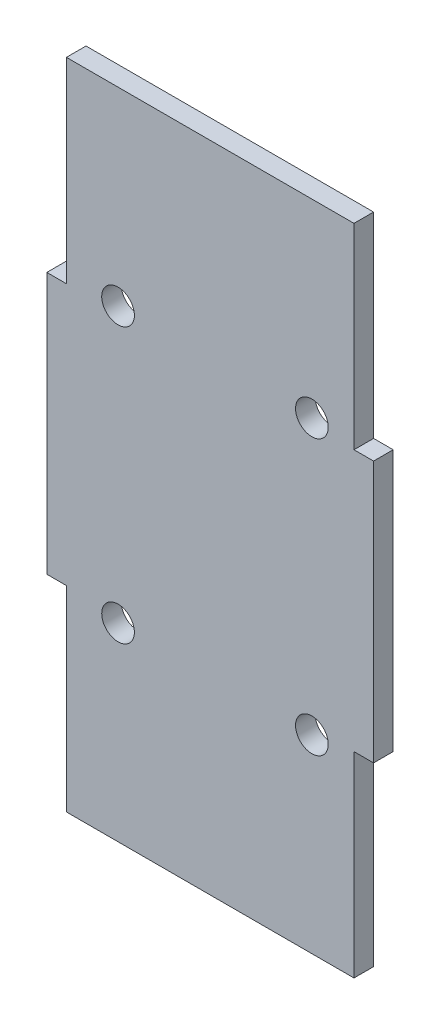
ISO-10303-21;
HEADER;
FILE_DESCRIPTION(('STEP AP214'),'2;1');
FILE_NAME('part.step','',(''),(''),'','','');
FILE_SCHEMA(('AUTOMOTIVE_DESIGN { 1 0 10303 214 1 1 1 1 }'));
ENDSEC;
DATA;
#1=APPLICATION_CONTEXT('core data for automotive mechanical design processes');
#2=APPLICATION_PROTOCOL_DEFINITION('international standard','automotive_design',2000,#1);
#3=PRODUCT_CONTEXT('',#1,'mechanical');
#4=PRODUCT('Part','Part','',(#3));
#5=PRODUCT_RELATED_PRODUCT_CATEGORY('part','',(#4));
#6=PRODUCT_DEFINITION_FORMATION('','',#4);
#7=PRODUCT_DEFINITION_CONTEXT('part definition',#1,'design');
#8=PRODUCT_DEFINITION('design','',#6,#7);
#9=PRODUCT_DEFINITION_SHAPE('','',#8);
#10=(LENGTH_UNIT() NAMED_UNIT(*) SI_UNIT(.MILLI.,.METRE.));
#11=(NAMED_UNIT(*) PLANE_ANGLE_UNIT() SI_UNIT($,.RADIAN.));
#12=(NAMED_UNIT(*) SI_UNIT($,.STERADIAN.) SOLID_ANGLE_UNIT());
#13=UNCERTAINTY_MEASURE_WITH_UNIT(LENGTH_MEASURE(1.E-05),#10,'distance_accuracy_value','');
#14=(GEOMETRIC_REPRESENTATION_CONTEXT(3) GLOBAL_UNCERTAINTY_ASSIGNED_CONTEXT((#13)) GLOBAL_UNIT_ASSIGNED_CONTEXT((#10,
#11,#12)) REPRESENTATION_CONTEXT('',''));
#15=CARTESIAN_POINT('',(0.,0.,0.));
#16=DIRECTION('',(0.,0.,1.));
#17=DIRECTION('',(1.,0.,0.));
#18=AXIS2_PLACEMENT_3D('',#15,#16,#17);
#19=CARTESIAN_POINT('',(0.,0.,3.));
#20=DIRECTION('',(0.,0.,-1.));
#21=DIRECTION('',(-1.,0.,0.));
#22=AXIS2_PLACEMENT_3D('',#19,#20,#21);
#23=PLANE('',#22);
#24=DIRECTION('',(0.,-1.,0.));
#25=VECTOR('',#24,1.);
#26=CARTESIAN_POINT('',(-25.,-30.7246376811594,3.));
#27=LINE('',#26,#25);
#28=CARTESIAN_POINT('',(-25.,9.27536231884058,3.));
#29=VERTEX_POINT('',#28);
#30=CARTESIAN_POINT('',(-25.,-30.7246376811594,3.));
#31=VERTEX_POINT('',#30);
#32=EDGE_CURVE('E200',#29,#31,#27,.T.);
#33=ORIENTED_EDGE('',*,*,#32,.T.);
#34=DIRECTION('',(1.,0.,0.));
#35=VECTOR('',#34,1.);
#36=CARTESIAN_POINT('',(-22.,-30.7246376811594,3.));
#37=LINE('',#36,#35);
#38=CARTESIAN_POINT('',(-22.,-30.7246376811594,3.));
#39=VERTEX_POINT('',#38);
#40=EDGE_CURVE('E112',#31,#39,#37,.T.);
#41=ORIENTED_EDGE('',*,*,#40,.T.);
#42=DIRECTION('',(0.,-1.,0.));
#43=VECTOR('',#42,1.);
#44=CARTESIAN_POINT('',(-22.,-30.7246376811594,3.));
#45=LINE('',#44,#43);
#46=CARTESIAN_POINT('',(-22.,-60.7246376811594,3.));
#47=VERTEX_POINT('',#46);
#48=EDGE_CURVE('E237',#39,#47,#45,.T.);
#49=ORIENTED_EDGE('',*,*,#48,.T.);
#50=DIRECTION('',(1.,0.,0.));
#51=VECTOR('',#50,1.);
#52=CARTESIAN_POINT('',(22.,-60.7246376811594,3.));
#53=LINE('',#52,#51);
#54=CARTESIAN_POINT('',(22.,-60.7246376811594,3.));
#55=VERTEX_POINT('',#54);
#56=EDGE_CURVE('E257',#47,#55,#53,.T.);
#57=ORIENTED_EDGE('',*,*,#56,.T.);
#58=DIRECTION('',(0.,1.,0.));
#59=VECTOR('',#58,1.);
#60=CARTESIAN_POINT('',(22.,-30.7246376811594,3.));
#61=LINE('',#60,#59);
#62=CARTESIAN_POINT('',(22.,-30.7246376811594,3.));
#63=VERTEX_POINT('',#62);
#64=EDGE_CURVE('E253',#55,#63,#61,.T.);
#65=ORIENTED_EDGE('',*,*,#64,.T.);
#66=DIRECTION('',(1.,0.,0.));
#67=VECTOR('',#66,1.);
#68=CARTESIAN_POINT('',(22.,-30.7246376811594,3.));
#69=LINE('',#68,#67);
#70=CARTESIAN_POINT('',(25.,-30.7246376811594,3.));
#71=VERTEX_POINT('',#70);
#72=EDGE_CURVE('E256',#63,#71,#69,.T.);
#73=ORIENTED_EDGE('',*,*,#72,.T.);
#74=DIRECTION('',(0.,1.,0.));
#75=VECTOR('',#74,1.);
#76=CARTESIAN_POINT('',(25.,-30.7246376811594,3.));
#77=LINE('',#76,#75);
#78=CARTESIAN_POINT('',(25.,9.27536231884058,3.));
#79=VERTEX_POINT('',#78);
#80=EDGE_CURVE('E261',#71,#79,#77,.T.);
#81=ORIENTED_EDGE('',*,*,#80,.T.);
#82=DIRECTION('',(-1.,0.,0.));
#83=VECTOR('',#82,1.);
#84=CARTESIAN_POINT('',(25.,9.27536231884058,3.));
#85=LINE('',#84,#83);
#86=CARTESIAN_POINT('',(22.,9.27536231884058,3.));
#87=VERTEX_POINT('',#86);
#88=EDGE_CURVE('E268',#79,#87,#85,.T.);
#89=ORIENTED_EDGE('',*,*,#88,.T.);
#90=DIRECTION('',(0.,1.,0.));
#91=VECTOR('',#90,1.);
#92=CARTESIAN_POINT('',(22.,9.27536231884058,3.));
#93=LINE('',#92,#91);
#94=CARTESIAN_POINT('',(22.,39.2753623188406,3.));
#95=VERTEX_POINT('',#94);
#96=EDGE_CURVE('E143',#87,#95,#93,.T.);
#97=ORIENTED_EDGE('',*,*,#96,.T.);
#98=DIRECTION('',(-1.,0.,0.));
#99=VECTOR('',#98,1.);
#100=CARTESIAN_POINT('',(22.,39.2753623188406,3.));
#101=LINE('',#100,#99);
#102=CARTESIAN_POINT('',(-22.,39.2753623188406,3.));
#103=VERTEX_POINT('',#102);
#104=EDGE_CURVE('E137',#95,#103,#101,.T.);
#105=ORIENTED_EDGE('',*,*,#104,.T.);
#106=DIRECTION('',(0.,-1.,0.));
#107=VECTOR('',#106,1.);
#108=CARTESIAN_POINT('',(-22.,9.27536231884058,3.));
#109=LINE('',#108,#107);
#110=CARTESIAN_POINT('',(-22.,9.27536231884058,3.));
#111=VERTEX_POINT('',#110);
#112=EDGE_CURVE('E141',#103,#111,#109,.T.);
#113=ORIENTED_EDGE('',*,*,#112,.T.);
#114=DIRECTION('',(-1.,0.,0.));
#115=VECTOR('',#114,1.);
#116=CARTESIAN_POINT('',(-25.,9.27536231884058,3.));
#117=LINE('',#116,#115);
#118=EDGE_CURVE('E57',#111,#29,#117,.T.);
#119=ORIENTED_EDGE('',*,*,#118,.T.);
#120=EDGE_LOOP('',(#33,#41,#49,#57,#65,#73,#81,#89,#97,#105,#113,#119));
#121=FACE_BOUND('',#120,.T.);
#122=CARTESIAN_POINT('',(15.5589565336524,10.2753623188406,3.));
#123=DIRECTION('',(0.,0.,1.));
#124=DIRECTION('',(1.,0.,0.));
#125=AXIS2_PLACEMENT_3D('',#122,#123,#124);
#126=CIRCLE('',#125,2.5);
#127=CARTESIAN_POINT('',(18.0589565336524,10.2753623188406,3.));
#128=VERTEX_POINT('',#127);
#129=EDGE_CURVE('E170',#128,#128,#126,.T.);
#130=ORIENTED_EDGE('',*,*,#129,.F.);
#131=EDGE_LOOP('',(#130));
#132=FACE_BOUND('',#131,.T.);
#133=CARTESIAN_POINT('',(-14.0986136380151,10.2753623188406,3.));
#134=DIRECTION('',(0.,0.,1.));
#135=DIRECTION('',(1.,0.,0.));
#136=AXIS2_PLACEMENT_3D('',#133,#134,#135);
#137=CIRCLE('',#136,2.5);
#138=CARTESIAN_POINT('',(-11.5986136380151,10.2753623188406,3.));
#139=VERTEX_POINT('',#138);
#140=EDGE_CURVE('E338',#139,#139,#137,.T.);
#141=ORIENTED_EDGE('',*,*,#140,.F.);
#142=EDGE_LOOP('',(#141));
#143=FACE_BOUND('',#142,.T.);
#144=CARTESIAN_POINT('',(15.5589565336524,-31.7246376811594,3.));
#145=DIRECTION('',(0.,0.,1.));
#146=DIRECTION('',(-1.,0.,0.));
#147=AXIS2_PLACEMENT_3D('',#144,#145,#146);
#148=CIRCLE('',#147,2.5);
#149=CARTESIAN_POINT('',(13.0589565336524,-31.7246376811594,3.));
#150=VERTEX_POINT('',#149);
#151=EDGE_CURVE('E330',#150,#150,#148,.T.);
#152=ORIENTED_EDGE('',*,*,#151,.F.);
#153=EDGE_LOOP('',(#152));
#154=FACE_BOUND('',#153,.T.);
#155=CARTESIAN_POINT('',(-14.0986136380151,-31.7246376811594,3.));
#156=DIRECTION('',(0.,0.,1.));
#157=DIRECTION('',(-1.,0.,0.));
#158=AXIS2_PLACEMENT_3D('',#155,#156,#157);
#159=CIRCLE('',#158,2.5);
#160=CARTESIAN_POINT('',(-16.5986136380151,-31.7246376811594,3.));
#161=VERTEX_POINT('',#160);
#162=EDGE_CURVE('E319',#161,#161,#159,.T.);
#163=ORIENTED_EDGE('',*,*,#162,.F.);
#164=EDGE_LOOP('',(#163));
#165=FACE_BOUND('',#164,.T.);
#166=ADVANCED_FACE('F39',(#121,#132,#143,#154,#165),#23,.F.);
#167=CARTESIAN_POINT('',(0.,0.,0.));
#168=DIRECTION('',(0.,0.,-1.));
#169=DIRECTION('',(-1.,0.,0.));
#170=AXIS2_PLACEMENT_3D('',#167,#168,#169);
#171=PLANE('',#170);
#172=CARTESIAN_POINT('',(15.5589565336524,-31.7246376811594,0.));
#173=DIRECTION('',(0.,0.,1.));
#174=DIRECTION('',(-1.,0.,0.));
#175=AXIS2_PLACEMENT_3D('',#172,#173,#174);
#176=CIRCLE('',#175,2.5);
#177=CARTESIAN_POINT('',(13.0589565336524,-31.7246376811594,0.));
#178=VERTEX_POINT('',#177);
#179=EDGE_CURVE('E327',#178,#178,#176,.T.);
#180=ORIENTED_EDGE('',*,*,#179,.T.);
#181=EDGE_LOOP('',(#180));
#182=FACE_BOUND('',#181,.T.);
#183=CARTESIAN_POINT('',(15.5589565336524,10.2753623188406,0.));
#184=DIRECTION('',(0.,0.,1.));
#185=DIRECTION('',(1.,0.,0.));
#186=AXIS2_PLACEMENT_3D('',#183,#184,#185);
#187=CIRCLE('',#186,2.5);
#188=CARTESIAN_POINT('',(18.0589565336524,10.2753623188406,0.));
#189=VERTEX_POINT('',#188);
#190=EDGE_CURVE('E342',#189,#189,#187,.T.);
#191=ORIENTED_EDGE('',*,*,#190,.T.);
#192=EDGE_LOOP('',(#191));
#193=FACE_BOUND('',#192,.T.);
#194=DIRECTION('',(0.,-1.,0.));
#195=VECTOR('',#194,1.);
#196=CARTESIAN_POINT('',(-25.,-30.7246376811594,0.));
#197=LINE('',#196,#195);
#198=CARTESIAN_POINT('',(-25.,9.27536231884058,0.));
#199=VERTEX_POINT('',#198);
#200=CARTESIAN_POINT('',(-25.,-30.7246376811594,0.));
#201=VERTEX_POINT('',#200);
#202=EDGE_CURVE('E165',#199,#201,#197,.T.);
#203=ORIENTED_EDGE('',*,*,#202,.F.);
#204=DIRECTION('',(-1.,0.,0.));
#205=VECTOR('',#204,1.);
#206=CARTESIAN_POINT('',(-25.,9.27536231884058,0.));
#207=LINE('',#206,#205);
#208=CARTESIAN_POINT('',(-22.,9.27536231884058,0.));
#209=VERTEX_POINT('',#208);
#210=EDGE_CURVE('E104',#209,#199,#207,.T.);
#211=ORIENTED_EDGE('',*,*,#210,.F.);
#212=DIRECTION('',(0.,-1.,0.));
#213=VECTOR('',#212,1.);
#214=CARTESIAN_POINT('',(-22.,9.27536231884058,0.));
#215=LINE('',#214,#213);
#216=CARTESIAN_POINT('',(-22.,39.2753623188406,0.));
#217=VERTEX_POINT('',#216);
#218=EDGE_CURVE('E98',#217,#209,#215,.T.);
#219=ORIENTED_EDGE('',*,*,#218,.F.);
#220=DIRECTION('',(-1.,0.,0.));
#221=VECTOR('',#220,1.);
#222=CARTESIAN_POINT('',(22.,39.2753623188406,0.));
#223=LINE('',#222,#221);
#224=CARTESIAN_POINT('',(22.,39.2753623188406,0.));
#225=VERTEX_POINT('',#224);
#226=EDGE_CURVE('E152',#225,#217,#223,.T.);
#227=ORIENTED_EDGE('',*,*,#226,.F.);
#228=DIRECTION('',(0.,1.,0.));
#229=VECTOR('',#228,1.);
#230=CARTESIAN_POINT('',(22.,9.27536231884058,0.));
#231=LINE('',#230,#229);
#232=CARTESIAN_POINT('',(22.,9.27536231884058,0.));
#233=VERTEX_POINT('',#232);
#234=EDGE_CURVE('E191',#233,#225,#231,.T.);
#235=ORIENTED_EDGE('',*,*,#234,.F.);
#236=DIRECTION('',(-1.,0.,0.));
#237=VECTOR('',#236,1.);
#238=CARTESIAN_POINT('',(25.,9.27536231884058,0.));
#239=LINE('',#238,#237);
#240=CARTESIAN_POINT('',(25.,9.27536231884058,0.));
#241=VERTEX_POINT('',#240);
#242=EDGE_CURVE('E188',#241,#233,#239,.T.);
#243=ORIENTED_EDGE('',*,*,#242,.F.);
#244=DIRECTION('',(0.,1.,0.));
#245=VECTOR('',#244,1.);
#246=CARTESIAN_POINT('',(25.,-30.7246376811594,0.));
#247=LINE('',#246,#245);
#248=CARTESIAN_POINT('',(25.,-30.7246376811594,0.));
#249=VERTEX_POINT('',#248);
#250=EDGE_CURVE('E185',#249,#241,#247,.T.);
#251=ORIENTED_EDGE('',*,*,#250,.F.);
#252=DIRECTION('',(1.,0.,0.));
#253=VECTOR('',#252,1.);
#254=CARTESIAN_POINT('',(22.,-30.7246376811594,0.));
#255=LINE('',#254,#253);
#256=CARTESIAN_POINT('',(22.,-30.7246376811594,0.));
#257=VERTEX_POINT('',#256);
#258=EDGE_CURVE('E182',#257,#249,#255,.T.);
#259=ORIENTED_EDGE('',*,*,#258,.F.);
#260=DIRECTION('',(0.,1.,0.));
#261=VECTOR('',#260,1.);
#262=CARTESIAN_POINT('',(22.,-30.7246376811594,0.));
#263=LINE('',#262,#261);
#264=CARTESIAN_POINT('',(22.,-60.7246376811594,0.));
#265=VERTEX_POINT('',#264);
#266=EDGE_CURVE('E179',#265,#257,#263,.T.);
#267=ORIENTED_EDGE('',*,*,#266,.F.);
#268=DIRECTION('',(1.,0.,0.));
#269=VECTOR('',#268,1.);
#270=CARTESIAN_POINT('',(22.,-60.7246376811594,0.));
#271=LINE('',#270,#269);
#272=CARTESIAN_POINT('',(-22.,-60.7246376811594,0.));
#273=VERTEX_POINT('',#272);
#274=EDGE_CURVE('E176',#273,#265,#271,.T.);
#275=ORIENTED_EDGE('',*,*,#274,.F.);
#276=DIRECTION('',(0.,-1.,0.));
#277=VECTOR('',#276,1.);
#278=CARTESIAN_POINT('',(-22.,-30.7246376811594,0.));
#279=LINE('',#278,#277);
#280=CARTESIAN_POINT('',(-22.,-30.7246376811594,0.));
#281=VERTEX_POINT('',#280);
#282=EDGE_CURVE('E173',#281,#273,#279,.T.);
#283=ORIENTED_EDGE('',*,*,#282,.F.);
#284=DIRECTION('',(1.,0.,0.));
#285=VECTOR('',#284,1.);
#286=CARTESIAN_POINT('',(-22.,-30.7246376811594,0.));
#287=LINE('',#286,#285);
#288=EDGE_CURVE('E169',#201,#281,#287,.T.);
#289=ORIENTED_EDGE('',*,*,#288,.F.);
#290=EDGE_LOOP('',(#203,#211,#219,#227,#235,#243,#251,#259,#267,#275,#283,#289));
#291=FACE_BOUND('',#290,.T.);
#292=CARTESIAN_POINT('',(-14.0986136380151,10.2753623188406,0.));
#293=DIRECTION('',(0.,0.,1.));
#294=DIRECTION('',(1.,0.,0.));
#295=AXIS2_PLACEMENT_3D('',#292,#293,#294);
#296=CIRCLE('',#295,2.5);
#297=CARTESIAN_POINT('',(-11.5986136380151,10.2753623188406,0.));
#298=VERTEX_POINT('',#297);
#299=EDGE_CURVE('E334',#298,#298,#296,.T.);
#300=ORIENTED_EDGE('',*,*,#299,.T.);
#301=EDGE_LOOP('',(#300));
#302=FACE_BOUND('',#301,.T.);
#303=CARTESIAN_POINT('',(-14.0986136380151,-31.7246376811594,0.));
#304=DIRECTION('',(0.,0.,1.));
#305=DIRECTION('',(-1.,0.,0.));
#306=AXIS2_PLACEMENT_3D('',#303,#304,#305);
#307=CIRCLE('',#306,2.5);
#308=CARTESIAN_POINT('',(-16.5986136380151,-31.7246376811594,0.));
#309=VERTEX_POINT('',#308);
#310=EDGE_CURVE('E322',#309,#309,#307,.T.);
#311=ORIENTED_EDGE('',*,*,#310,.T.);
#312=EDGE_LOOP('',(#311));
#313=FACE_BOUND('',#312,.T.);
#314=ADVANCED_FACE('F241',(#182,#193,#291,#302,#313),#171,.T.);
#315=CARTESIAN_POINT('',(-25.,-30.7246376811594,3.));
#316=DIRECTION('',(1.,0.,0.));
#317=DIRECTION('',(0.,1.,0.));
#318=AXIS2_PLACEMENT_3D('',#315,#316,#317);
#319=PLANE('',#318);
#320=ORIENTED_EDGE('',*,*,#202,.T.);
#321=DIRECTION('',(0.,0.,-1.));
#322=VECTOR('',#321,1.);
#323=CARTESIAN_POINT('',(-25.,-30.7246376811594,3.));
#324=LINE('',#323,#322);
#325=EDGE_CURVE('E11',#31,#201,#324,.T.);
#326=ORIENTED_EDGE('',*,*,#325,.F.);
#327=ORIENTED_EDGE('',*,*,#32,.F.);
#328=DIRECTION('',(0.,0.,-1.));
#329=VECTOR('',#328,1.);
#330=CARTESIAN_POINT('',(-25.,9.27536231884058,3.));
#331=LINE('',#330,#329);
#332=EDGE_CURVE('E161',#29,#199,#331,.T.);
#333=ORIENTED_EDGE('',*,*,#332,.T.);
#334=EDGE_LOOP('',(#320,#326,#327,#333));
#335=FACE_BOUND('',#334,.T.);
#336=ADVANCED_FACE('F41',(#335),#319,.F.);
#337=CARTESIAN_POINT('',(-22.,-30.7246376811594,3.));
#338=DIRECTION('',(0.,1.,0.));
#339=DIRECTION('',(0.,0.,1.));
#340=AXIS2_PLACEMENT_3D('',#337,#338,#339);
#341=PLANE('',#340);
#342=ORIENTED_EDGE('',*,*,#288,.T.);
#343=DIRECTION('',(0.,0.,-1.));
#344=VECTOR('',#343,1.);
#345=CARTESIAN_POINT('',(-22.,-30.7246376811594,3.));
#346=LINE('',#345,#344);
#347=EDGE_CURVE('E49',#39,#281,#346,.T.);
#348=ORIENTED_EDGE('',*,*,#347,.F.);
#349=ORIENTED_EDGE('',*,*,#40,.F.);
#350=ORIENTED_EDGE('',*,*,#325,.T.);
#351=EDGE_LOOP('',(#342,#348,#349,#350));
#352=FACE_BOUND('',#351,.T.);
#353=ADVANCED_FACE('F460',(#352),#341,.F.);
#354=CARTESIAN_POINT('',(-22.,-30.7246376811594,3.));
#355=DIRECTION('',(1.,0.,0.));
#356=DIRECTION('',(0.,1.,0.));
#357=AXIS2_PLACEMENT_3D('',#354,#355,#356);
#358=PLANE('',#357);
#359=ORIENTED_EDGE('',*,*,#282,.T.);
#360=DIRECTION('',(0.,0.,-1.));
#361=VECTOR('',#360,1.);
#362=CARTESIAN_POINT('',(-22.,-60.7246376811594,3.));
#363=LINE('',#362,#361);
#364=EDGE_CURVE('E227',#47,#273,#363,.T.);
#365=ORIENTED_EDGE('',*,*,#364,.F.);
#366=ORIENTED_EDGE('',*,*,#48,.F.);
#367=ORIENTED_EDGE('',*,*,#347,.T.);
#368=EDGE_LOOP('',(#359,#365,#366,#367));
#369=FACE_BOUND('',#368,.T.);
#370=ADVANCED_FACE('F235',(#369),#358,.F.);
#371=CARTESIAN_POINT('',(22.,-60.7246376811594,3.));
#372=DIRECTION('',(0.,1.,0.));
#373=DIRECTION('',(0.,0.,1.));
#374=AXIS2_PLACEMENT_3D('',#371,#372,#373);
#375=PLANE('',#374);
#376=ORIENTED_EDGE('',*,*,#274,.T.);
#377=DIRECTION('',(0.,0.,-1.));
#378=VECTOR('',#377,1.);
#379=CARTESIAN_POINT('',(22.,-60.7246376811594,3.));
#380=LINE('',#379,#378);
#381=EDGE_CURVE('E223',#55,#265,#380,.T.);
#382=ORIENTED_EDGE('',*,*,#381,.F.);
#383=ORIENTED_EDGE('',*,*,#56,.F.);
#384=ORIENTED_EDGE('',*,*,#364,.T.);
#385=EDGE_LOOP('',(#376,#382,#383,#384));
#386=FACE_BOUND('',#385,.T.);
#387=ADVANCED_FACE('F247',(#386),#375,.F.);
#388=CARTESIAN_POINT('',(22.,-30.7246376811594,3.));
#389=DIRECTION('',(-1.,0.,0.));
#390=DIRECTION('',(0.,-1.,0.));
#391=AXIS2_PLACEMENT_3D('',#388,#389,#390);
#392=PLANE('',#391);
#393=ORIENTED_EDGE('',*,*,#266,.T.);
#394=DIRECTION('',(0.,0.,-1.));
#395=VECTOR('',#394,1.);
#396=CARTESIAN_POINT('',(22.,-30.7246376811594,3.));
#397=LINE('',#396,#395);
#398=EDGE_CURVE('E219',#63,#257,#397,.T.);
#399=ORIENTED_EDGE('',*,*,#398,.F.);
#400=ORIENTED_EDGE('',*,*,#64,.F.);
#401=ORIENTED_EDGE('',*,*,#381,.T.);
#402=EDGE_LOOP('',(#393,#399,#400,#401));
#403=FACE_BOUND('',#402,.T.);
#404=ADVANCED_FACE('F251',(#403),#392,.F.);
#405=CARTESIAN_POINT('',(22.,-30.7246376811594,3.));
#406=DIRECTION('',(0.,1.,0.));
#407=DIRECTION('',(0.,0.,1.));
#408=AXIS2_PLACEMENT_3D('',#405,#406,#407);
#409=PLANE('',#408);
#410=ORIENTED_EDGE('',*,*,#258,.T.);
#411=DIRECTION('',(0.,0.,-1.));
#412=VECTOR('',#411,1.);
#413=CARTESIAN_POINT('',(25.,-30.7246376811594,3.));
#414=LINE('',#413,#412);
#415=EDGE_CURVE('E215',#71,#249,#414,.T.);
#416=ORIENTED_EDGE('',*,*,#415,.F.);
#417=ORIENTED_EDGE('',*,*,#72,.F.);
#418=ORIENTED_EDGE('',*,*,#398,.T.);
#419=EDGE_LOOP('',(#410,#416,#417,#418));
#420=FACE_BOUND('',#419,.T.);
#421=ADVANCED_FACE('F425',(#420),#409,.F.);
#422=CARTESIAN_POINT('',(25.,-30.7246376811594,3.));
#423=DIRECTION('',(-1.,0.,0.));
#424=DIRECTION('',(0.,0.,1.));
#425=AXIS2_PLACEMENT_3D('',#422,#423,#424);
#426=PLANE('',#425);
#427=ORIENTED_EDGE('',*,*,#250,.T.);
#428=DIRECTION('',(0.,0.,-1.));
#429=VECTOR('',#428,1.);
#430=CARTESIAN_POINT('',(25.,9.27536231884058,3.));
#431=LINE('',#430,#429);
#432=EDGE_CURVE('E211',#79,#241,#431,.T.);
#433=ORIENTED_EDGE('',*,*,#432,.F.);
#434=ORIENTED_EDGE('',*,*,#80,.F.);
#435=ORIENTED_EDGE('',*,*,#415,.T.);
#436=EDGE_LOOP('',(#427,#433,#434,#435));
#437=FACE_BOUND('',#436,.T.);
#438=ADVANCED_FACE('F416',(#437),#426,.F.);
#439=CARTESIAN_POINT('',(25.,9.27536231884058,3.));
#440=DIRECTION('',(0.,-1.,0.));
#441=DIRECTION('',(0.,0.,-1.));
#442=AXIS2_PLACEMENT_3D('',#439,#440,#441);
#443=PLANE('',#442);
#444=ORIENTED_EDGE('',*,*,#242,.T.);
#445=DIRECTION('',(0.,0.,-1.));
#446=VECTOR('',#445,1.);
#447=CARTESIAN_POINT('',(22.,9.27536231884058,3.));
#448=LINE('',#447,#446);
#449=EDGE_CURVE('E207',#87,#233,#448,.T.);
#450=ORIENTED_EDGE('',*,*,#449,.F.);
#451=ORIENTED_EDGE('',*,*,#88,.F.);
#452=ORIENTED_EDGE('',*,*,#432,.T.);
#453=EDGE_LOOP('',(#444,#450,#451,#452));
#454=FACE_BOUND('',#453,.T.);
#455=ADVANCED_FACE('F276',(#454),#443,.F.);
#456=CARTESIAN_POINT('',(22.,9.27536231884058,3.));
#457=DIRECTION('',(-1.,0.,0.));
#458=DIRECTION('',(0.,0.,1.));
#459=AXIS2_PLACEMENT_3D('',#456,#457,#458);
#460=PLANE('',#459);
#461=ORIENTED_EDGE('',*,*,#234,.T.);
#462=DIRECTION('',(0.,0.,-1.));
#463=VECTOR('',#462,1.);
#464=CARTESIAN_POINT('',(22.,39.2753623188406,3.));
#465=LINE('',#464,#463);
#466=EDGE_CURVE('E154',#95,#225,#465,.T.);
#467=ORIENTED_EDGE('',*,*,#466,.F.);
#468=ORIENTED_EDGE('',*,*,#96,.F.);
#469=ORIENTED_EDGE('',*,*,#449,.T.);
#470=EDGE_LOOP('',(#461,#467,#468,#469));
#471=FACE_BOUND('',#470,.T.);
#472=ADVANCED_FACE('F280',(#471),#460,.F.);
#473=CARTESIAN_POINT('',(22.,39.2753623188406,3.));
#474=DIRECTION('',(0.,-1.,0.));
#475=DIRECTION('',(1.,0.,0.));
#476=AXIS2_PLACEMENT_3D('',#473,#474,#475);
#477=PLANE('',#476);
#478=ORIENTED_EDGE('',*,*,#226,.T.);
#479=DIRECTION('',(0.,0.,-1.));
#480=VECTOR('',#479,1.);
#481=CARTESIAN_POINT('',(-22.,39.2753623188406,3.));
#482=LINE('',#481,#480);
#483=EDGE_CURVE('E149',#103,#217,#482,.T.);
#484=ORIENTED_EDGE('',*,*,#483,.F.);
#485=ORIENTED_EDGE('',*,*,#104,.F.);
#486=ORIENTED_EDGE('',*,*,#466,.T.);
#487=EDGE_LOOP('',(#478,#484,#485,#486));
#488=FACE_BOUND('',#487,.T.);
#489=ADVANCED_FACE('F150',(#488),#477,.F.);
#490=CARTESIAN_POINT('',(-22.,9.27536231884058,3.));
#491=DIRECTION('',(1.,0.,0.));
#492=DIRECTION('',(0.,0.,-1.));
#493=AXIS2_PLACEMENT_3D('',#490,#491,#492);
#494=PLANE('',#493);
#495=ORIENTED_EDGE('',*,*,#218,.T.);
#496=DIRECTION('',(0.,0.,-1.));
#497=VECTOR('',#496,1.);
#498=CARTESIAN_POINT('',(-22.,9.27536231884058,3.));
#499=LINE('',#498,#497);
#500=EDGE_CURVE('E155',#111,#209,#499,.T.);
#501=ORIENTED_EDGE('',*,*,#500,.F.);
#502=ORIENTED_EDGE('',*,*,#112,.F.);
#503=ORIENTED_EDGE('',*,*,#483,.T.);
#504=EDGE_LOOP('',(#495,#501,#502,#503));
#505=FACE_BOUND('',#504,.T.);
#506=ADVANCED_FACE('F157',(#505),#494,.F.);
#507=CARTESIAN_POINT('',(-25.,9.27536231884058,3.));
#508=DIRECTION('',(0.,-1.,0.));
#509=DIRECTION('',(0.,0.,-1.));
#510=AXIS2_PLACEMENT_3D('',#507,#508,#509);
#511=PLANE('',#510);
#512=ORIENTED_EDGE('',*,*,#210,.T.);
#513=ORIENTED_EDGE('',*,*,#332,.F.);
#514=ORIENTED_EDGE('',*,*,#118,.F.);
#515=ORIENTED_EDGE('',*,*,#500,.T.);
#516=EDGE_LOOP('',(#512,#513,#514,#515));
#517=FACE_BOUND('',#516,.T.);
#518=ADVANCED_FACE('F284',(#517),#511,.F.);
#519=CARTESIAN_POINT('',(15.5589565336524,10.2753623188406,3.));
#520=DIRECTION('',(0.,0.,-1.));
#521=DIRECTION('',(-1.,0.,0.));
#522=AXIS2_PLACEMENT_3D('',#519,#520,#521);
#523=CYLINDRICAL_SURFACE('',#522,2.5);
#524=ORIENTED_EDGE('',*,*,#129,.T.);
#525=EDGE_LOOP('',(#524));
#526=FACE_BOUND('',#525,.T.);
#527=ORIENTED_EDGE('',*,*,#190,.F.);
#528=EDGE_LOOP('',(#527));
#529=FACE_BOUND('',#528,.T.);
#530=ADVANCED_FACE('F286',(#526,#529),#523,.F.);
#531=CARTESIAN_POINT('',(-14.0986136380151,10.2753623188406,3.));
#532=DIRECTION('',(0.,0.,-1.));
#533=DIRECTION('',(-1.,0.,0.));
#534=AXIS2_PLACEMENT_3D('',#531,#532,#533);
#535=CYLINDRICAL_SURFACE('',#534,2.5);
#536=ORIENTED_EDGE('',*,*,#140,.T.);
#537=EDGE_LOOP('',(#536));
#538=FACE_BOUND('',#537,.T.);
#539=ORIENTED_EDGE('',*,*,#299,.F.);
#540=EDGE_LOOP('',(#539));
#541=FACE_BOUND('',#540,.T.);
#542=ADVANCED_FACE('F292',(#538,#541),#535,.F.);
#543=CARTESIAN_POINT('',(15.5589565336524,-31.7246376811594,3.));
#544=DIRECTION('',(0.,0.,-1.));
#545=DIRECTION('',(-1.,0.,0.));
#546=AXIS2_PLACEMENT_3D('',#543,#544,#545);
#547=CYLINDRICAL_SURFACE('',#546,2.5);
#548=ORIENTED_EDGE('',*,*,#151,.T.);
#549=EDGE_LOOP('',(#548));
#550=FACE_BOUND('',#549,.T.);
#551=ORIENTED_EDGE('',*,*,#179,.F.);
#552=EDGE_LOOP('',(#551));
#553=FACE_BOUND('',#552,.T.);
#554=ADVANCED_FACE('F306',(#550,#553),#547,.F.);
#555=CARTESIAN_POINT('',(-14.0986136380151,-31.7246376811594,3.));
#556=DIRECTION('',(0.,0.,-1.));
#557=DIRECTION('',(-1.,0.,0.));
#558=AXIS2_PLACEMENT_3D('',#555,#556,#557);
#559=CYLINDRICAL_SURFACE('',#558,2.5);
#560=ORIENTED_EDGE('',*,*,#162,.T.);
#561=EDGE_LOOP('',(#560));
#562=FACE_BOUND('',#561,.T.);
#563=ORIENTED_EDGE('',*,*,#310,.F.);
#564=EDGE_LOOP('',(#563));
#565=FACE_BOUND('',#564,.T.);
#566=ADVANCED_FACE('F310',(#562,#565),#559,.F.);
#567=CLOSED_SHELL('',(#166,#314,#336,#353,#370,#387,#404,#421,#438,#455,#472,#489,#506,#518,
#530,#542,#554,#566));
#568=MANIFOLD_SOLID_BREP('B2',#567);
#569=ADVANCED_BREP_SHAPE_REPRESENTATION('',(#18,#568),#14);
#570=SHAPE_DEFINITION_REPRESENTATION(#9,#569);
ENDSEC;
END-ISO-10303-21;
